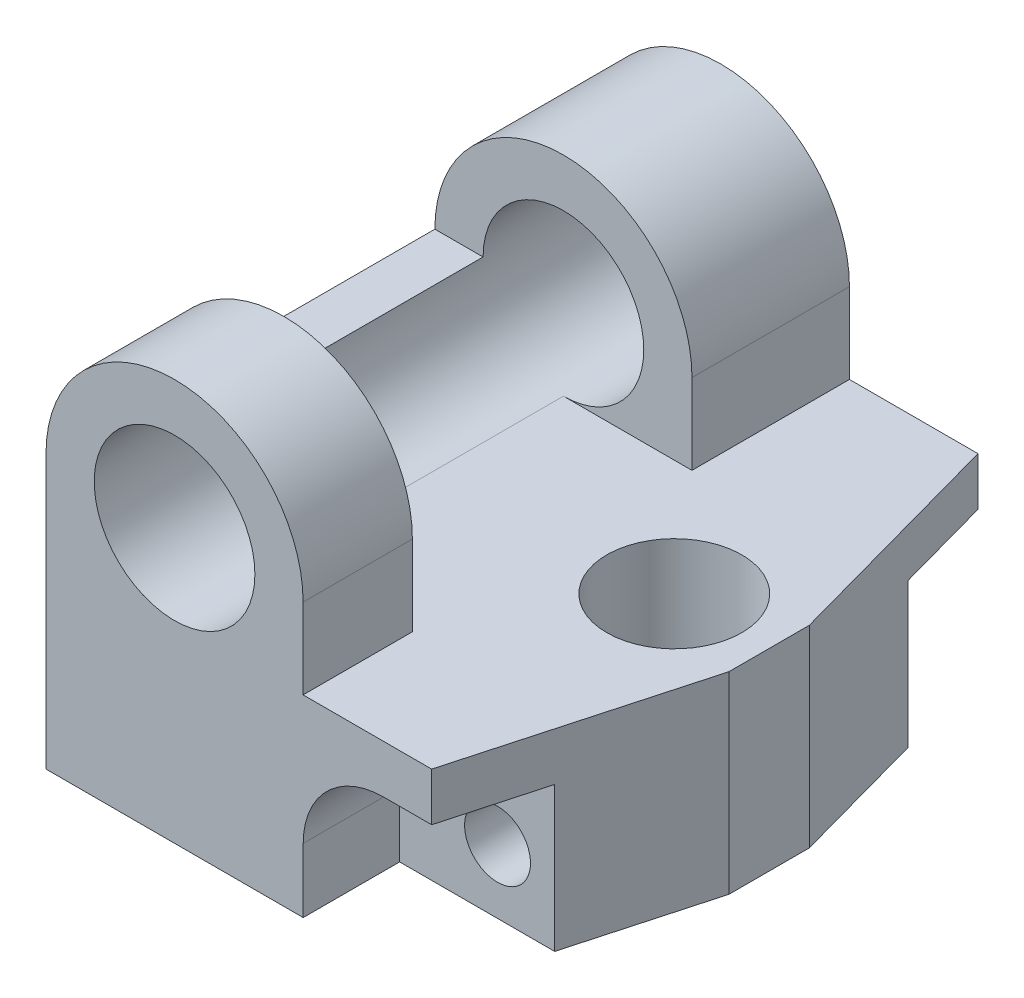
ISO-10303-21;
HEADER;
FILE_DESCRIPTION(('STEP AP214'),'2;1');
FILE_NAME('part.step','',(''),(''),'','','');
FILE_SCHEMA(('AUTOMOTIVE_DESIGN { 1 0 10303 214 1 1 1 1 }'));
ENDSEC;
DATA;
#1=APPLICATION_CONTEXT('core data for automotive mechanical design processes');
#2=APPLICATION_PROTOCOL_DEFINITION('international standard','automotive_design',2000,#1);
#3=PRODUCT_CONTEXT('',#1,'mechanical');
#4=PRODUCT('Part','Part','',(#3));
#5=PRODUCT_RELATED_PRODUCT_CATEGORY('part','',(#4));
#6=PRODUCT_DEFINITION_FORMATION('','',#4);
#7=PRODUCT_DEFINITION_CONTEXT('part definition',#1,'design');
#8=PRODUCT_DEFINITION('design','',#6,#7);
#9=PRODUCT_DEFINITION_SHAPE('','',#8);
#10=(LENGTH_UNIT() NAMED_UNIT(*) SI_UNIT(.MILLI.,.METRE.));
#11=(NAMED_UNIT(*) PLANE_ANGLE_UNIT() SI_UNIT($,.RADIAN.));
#12=(NAMED_UNIT(*) SI_UNIT($,.STERADIAN.) SOLID_ANGLE_UNIT());
#13=UNCERTAINTY_MEASURE_WITH_UNIT(LENGTH_MEASURE(1.E-05),#10,'distance_accuracy_value','');
#14=(GEOMETRIC_REPRESENTATION_CONTEXT(3) GLOBAL_UNCERTAINTY_ASSIGNED_CONTEXT((#13)) GLOBAL_UNIT_ASSIGNED_CONTEXT((#10,
#11,#12)) REPRESENTATION_CONTEXT('',''));
#15=CARTESIAN_POINT('',(0.,0.,0.));
#16=DIRECTION('',(0.,0.,1.));
#17=DIRECTION('',(1.,0.,0.));
#18=AXIS2_PLACEMENT_3D('',#15,#16,#17);
#19=CARTESIAN_POINT('',(8.,2.5,8.5));
#20=DIRECTION('',(-1.,0.,0.));
#21=DIRECTION('',(0.,0.,1.));
#22=AXIS2_PLACEMENT_3D('',#19,#20,#21);
#23=PLANE('',#22);
#24=DIRECTION('',(0.,1.,0.));
#25=VECTOR('',#24,1.);
#26=CARTESIAN_POINT('',(8.,0.,-3.6));
#27=LINE('',#26,#25);
#28=CARTESIAN_POINT('',(8.,0.,-3.6));
#29=VERTEX_POINT('',#28);
#30=CARTESIAN_POINT('',(8.,2.5,-3.6));
#31=VERTEX_POINT('',#30);
#32=EDGE_CURVE('E194',#29,#31,#27,.T.);
#33=ORIENTED_EDGE('',*,*,#32,.F.);
#34=DIRECTION('',(0.,0.,-1.));
#35=VECTOR('',#34,1.);
#36=CARTESIAN_POINT('',(8.,0.,8.5));
#37=LINE('',#36,#35);
#38=CARTESIAN_POINT('',(8.,0.,-8.5));
#39=VERTEX_POINT('',#38);
#40=EDGE_CURVE('E219',#29,#39,#37,.T.);
#41=ORIENTED_EDGE('',*,*,#40,.T.);
#42=DIRECTION('',(0.,1.,0.));
#43=VECTOR('',#42,1.);
#44=CARTESIAN_POINT('',(8.,2.5,-8.5));
#45=LINE('',#44,#43);
#46=CARTESIAN_POINT('',(8.,2.5,-8.5));
#47=VERTEX_POINT('',#46);
#48=EDGE_CURVE('E660',#39,#47,#45,.T.);
#49=ORIENTED_EDGE('',*,*,#48,.T.);
#50=DIRECTION('',(0.,0.,-1.));
#51=VECTOR('',#50,1.);
#52=CARTESIAN_POINT('',(8.,2.5,8.5));
#53=LINE('',#52,#51);
#54=EDGE_CURVE('E211',#31,#47,#53,.T.);
#55=ORIENTED_EDGE('',*,*,#54,.F.);
#56=EDGE_LOOP('',(#33,#41,#49,#55));
#57=FACE_BOUND('',#56,.T.);
#58=ADVANCED_FACE('F36',(#57),#23,.F.);
#59=CARTESIAN_POINT('',(4.,2.5,8.5));
#60=DIRECTION('',(0.,0.,-1.));
#61=DIRECTION('',(-1.,0.,0.));
#62=AXIS2_PLACEMENT_3D('',#59,#60,#61);
#63=CYLINDRICAL_SURFACE('',#62,4.);
#64=CARTESIAN_POINT('',(4.,2.5,-3.6));
#65=DIRECTION('',(0.,0.,1.));
#66=DIRECTION('',(1.,0.,0.));
#67=AXIS2_PLACEMENT_3D('',#64,#65,#66);
#68=CIRCLE('',#67,4.);
#69=CARTESIAN_POINT('',(0.,2.5,-3.6));
#70=VERTEX_POINT('',#69);
#71=EDGE_CURVE('E188',#31,#70,#68,.T.);
#72=ORIENTED_EDGE('',*,*,#71,.F.);
#73=ORIENTED_EDGE('',*,*,#54,.T.);
#74=CARTESIAN_POINT('',(4.,2.5,-8.5));
#75=DIRECTION('',(0.,0.,1.));
#76=DIRECTION('',(1.,0.,0.));
#77=AXIS2_PLACEMENT_3D('',#74,#75,#76);
#78=CIRCLE('',#77,4.);
#79=CARTESIAN_POINT('',(0.,2.5,-8.5));
#80=VERTEX_POINT('',#79);
#81=EDGE_CURVE('E202',#47,#80,#78,.T.);
#82=ORIENTED_EDGE('',*,*,#81,.T.);
#83=DIRECTION('',(0.,0.,-1.));
#84=VECTOR('',#83,1.);
#85=CARTESIAN_POINT('',(0.,2.5,8.5));
#86=LINE('',#85,#84);
#87=EDGE_CURVE('E199',#70,#80,#86,.T.);
#88=ORIENTED_EDGE('',*,*,#87,.F.);
#89=EDGE_LOOP('',(#72,#73,#82,#88));
#90=FACE_BOUND('',#89,.T.);
#91=ADVANCED_FACE('F200',(#90),#63,.T.);
#92=CARTESIAN_POINT('',(4.,2.5,8.5));
#93=DIRECTION('',(0.,0.,-1.));
#94=DIRECTION('',(-1.,0.,0.));
#95=AXIS2_PLACEMENT_3D('',#92,#93,#94);
#96=CYLINDRICAL_SURFACE('',#95,2.5);
#97=CARTESIAN_POINT('',(4.,2.5,-8.5));
#98=DIRECTION('',(0.,0.,1.));
#99=DIRECTION('',(1.,0.,0.));
#100=AXIS2_PLACEMENT_3D('',#97,#98,#99);
#101=CIRCLE('',#100,2.5);
#102=CARTESIAN_POINT('',(6.5,2.5,-8.5));
#103=VERTEX_POINT('',#102);
#104=EDGE_CURVE('E638',#103,#103,#101,.T.);
#105=ORIENTED_EDGE('',*,*,#104,.F.);
#106=EDGE_LOOP('',(#105));
#107=FACE_BOUND('',#106,.T.);
#108=CARTESIAN_POINT('',(4.,2.5,8.5));
#109=DIRECTION('',(0.,0.,1.));
#110=DIRECTION('',(1.,0.,0.));
#111=AXIS2_PLACEMENT_3D('',#108,#109,#110);
#112=CIRCLE('',#111,2.5);
#113=CARTESIAN_POINT('',(6.5,2.5,8.5));
#114=VERTEX_POINT('',#113);
#115=EDGE_CURVE('E639',#114,#114,#112,.T.);
#116=ORIENTED_EDGE('',*,*,#115,.T.);
#117=EDGE_LOOP('',(#116));
#118=FACE_BOUND('',#117,.T.);
#119=DIRECTION('',(0.,0.,-1.));
#120=VECTOR('',#119,1.);
#121=CARTESIAN_POINT('',(4.,0.,5.1));
#122=LINE('',#121,#120);
#123=CARTESIAN_POINT('',(4.,0.,5.1));
#124=VERTEX_POINT('',#123);
#125=CARTESIAN_POINT('',(4.,0.,-3.6));
#126=VERTEX_POINT('',#125);
#127=EDGE_CURVE('E322',#124,#126,#122,.T.);
#128=ORIENTED_EDGE('',*,*,#127,.T.);
#129=CARTESIAN_POINT('',(4.,2.5,-3.6));
#130=DIRECTION('',(0.,0.,-1.));
#131=DIRECTION('',(1.,0.,0.));
#132=AXIS2_PLACEMENT_3D('',#129,#130,#131);
#133=CIRCLE('',#132,2.5);
#134=CARTESIAN_POINT('',(1.5,2.5,-3.6));
#135=VERTEX_POINT('',#134);
#136=EDGE_CURVE('E187',#135,#126,#133,.T.);
#137=ORIENTED_EDGE('',*,*,#136,.F.);
#138=DIRECTION('',(0.,0.,-1.));
#139=VECTOR('',#138,1.);
#140=CARTESIAN_POINT('',(1.5,2.5,5.1));
#141=LINE('',#140,#139);
#142=CARTESIAN_POINT('',(1.5,2.5,5.1));
#143=VERTEX_POINT('',#142);
#144=EDGE_CURVE('E183',#143,#135,#141,.T.);
#145=ORIENTED_EDGE('',*,*,#144,.F.);
#146=CARTESIAN_POINT('',(4.,2.5,5.1));
#147=DIRECTION('',(0.,0.,-1.));
#148=DIRECTION('',(1.,0.,0.));
#149=AXIS2_PLACEMENT_3D('',#146,#147,#148);
#150=CIRCLE('',#149,2.5);
#151=EDGE_CURVE('E326',#143,#124,#150,.T.);
#152=ORIENTED_EDGE('',*,*,#151,.T.);
#153=EDGE_LOOP('',(#128,#137,#145,#152));
#154=FACE_BOUND('',#153,.T.);
#155=ADVANCED_FACE('F291',(#107,#118,#154),#96,.F.);
#156=CARTESIAN_POINT('',(4.,2.5,-8.5));
#157=DIRECTION('',(0.,0.,1.));
#158=DIRECTION('',(1.,0.,0.));
#159=AXIS2_PLACEMENT_3D('',#156,#157,#158);
#160=PLANE('',#159);
#161=ORIENTED_EDGE('',*,*,#104,.T.);
#162=EDGE_LOOP('',(#161));
#163=FACE_BOUND('',#162,.T.);
#164=DIRECTION('',(-1.,0.,0.));
#165=VECTOR('',#164,1.);
#166=CARTESIAN_POINT('',(12.,-1.5,-8.5));
#167=LINE('',#166,#165);
#168=CARTESIAN_POINT('',(12.,-1.5,-8.5));
#169=VERTEX_POINT('',#168);
#170=CARTESIAN_POINT('',(10.5034128963792,-1.5,-8.5));
#171=VERTEX_POINT('',#170);
#172=EDGE_CURVE('E272',#169,#171,#167,.T.);
#173=ORIENTED_EDGE('',*,*,#172,.T.);
#174=CARTESIAN_POINT('',(10.5034128963792,-4.,-8.5));
#175=DIRECTION('',(0.,0.,1.));
#176=DIRECTION('',(1.,0.,0.));
#177=AXIS2_PLACEMENT_3D('',#174,#175,#176);
#178=CIRCLE('',#177,2.5);
#179=CARTESIAN_POINT('',(8.00341289637922,-4.,-8.5));
#180=VERTEX_POINT('',#179);
#181=EDGE_CURVE('E11',#171,#180,#178,.T.);
#182=ORIENTED_EDGE('',*,*,#181,.T.);
#183=DIRECTION('',(0.,-1.,0.));
#184=VECTOR('',#183,1.);
#185=CARTESIAN_POINT('',(8.00341289637922,-1.5,-8.5));
#186=LINE('',#185,#184);
#187=CARTESIAN_POINT('',(8.00341289637922,-6.,-8.5));
#188=VERTEX_POINT('',#187);
#189=EDGE_CURVE('E596',#180,#188,#186,.T.);
#190=ORIENTED_EDGE('',*,*,#189,.T.);
#191=DIRECTION('',(1.,0.,0.));
#192=VECTOR('',#191,1.);
#193=CARTESIAN_POINT('',(0.,-6.,-8.5));
#194=LINE('',#193,#192);
#195=CARTESIAN_POINT('',(0.,-6.,-8.5));
#196=VERTEX_POINT('',#195);
#197=EDGE_CURVE('E642',#196,#188,#194,.T.);
#198=ORIENTED_EDGE('',*,*,#197,.F.);
#199=DIRECTION('',(0.,-1.,0.));
#200=VECTOR('',#199,1.);
#201=CARTESIAN_POINT('',(0.,0.,-8.5));
#202=LINE('',#201,#200);
#203=EDGE_CURVE('E214',#80,#196,#202,.T.);
#204=ORIENTED_EDGE('',*,*,#203,.F.);
#205=ORIENTED_EDGE('',*,*,#81,.F.);
#206=ORIENTED_EDGE('',*,*,#48,.F.);
#207=DIRECTION('',(-1.,0.,0.));
#208=VECTOR('',#207,1.);
#209=CARTESIAN_POINT('',(8.,0.,-8.5));
#210=LINE('',#209,#208);
#211=CARTESIAN_POINT('',(12.,0.,-8.5));
#212=VERTEX_POINT('',#211);
#213=EDGE_CURVE('E657',#212,#39,#210,.T.);
#214=ORIENTED_EDGE('',*,*,#213,.F.);
#215=DIRECTION('',(0.,1.,0.));
#216=VECTOR('',#215,1.);
#217=CARTESIAN_POINT('',(12.,-17.,-8.5));
#218=LINE('',#217,#216);
#219=EDGE_CURVE('E631',#169,#212,#218,.T.);
#220=ORIENTED_EDGE('',*,*,#219,.F.);
#221=EDGE_LOOP('',(#173,#182,#190,#198,#204,#205,#206,#214,#220));
#222=FACE_BOUND('',#221,.T.);
#223=ADVANCED_FACE('F430',(#163,#222),#160,.F.);
#224=CARTESIAN_POINT('',(0.,-6.,8.5));
#225=DIRECTION('',(0.,1.,0.));
#226=DIRECTION('',(0.,0.,1.));
#227=AXIS2_PLACEMENT_3D('',#224,#225,#226);
#228=PLANE('',#227);
#229=CARTESIAN_POINT('',(11.05,-6.,0.));
#230=DIRECTION('',(0.,1.,0.));
#231=DIRECTION('',(0.,0.,1.));
#232=AXIS2_PLACEMENT_3D('',#229,#230,#231);
#233=CIRCLE('',#232,2.1);
#234=CARTESIAN_POINT('',(11.05,-6.,2.1));
#235=VERTEX_POINT('',#234);
#236=EDGE_CURVE('E594',#235,#235,#233,.F.);
#237=ORIENTED_EDGE('',*,*,#236,.F.);
#238=EDGE_LOOP('',(#237));
#239=FACE_BOUND('',#238,.T.);
#240=DIRECTION('',(0.,0.,-1.));
#241=VECTOR('',#240,1.);
#242=CARTESIAN_POINT('',(8.00341289637922,-6.,8.5));
#243=LINE('',#242,#241);
#244=CARTESIAN_POINT('',(8.00341289637922,-6.,-5.50000000000001));
#245=VERTEX_POINT('',#244);
#246=EDGE_CURVE('E253',#245,#188,#243,.T.);
#247=ORIENTED_EDGE('',*,*,#246,.F.);
#248=DIRECTION('',(1.,0.,0.));
#249=VECTOR('',#248,1.);
#250=CARTESIAN_POINT('',(0.,-6.,-5.50000000000001));
#251=LINE('',#250,#249);
#252=CARTESIAN_POINT('',(12.8275862068965,-6.,-5.50000000000001));
#253=VERTEX_POINT('',#252);
#254=EDGE_CURVE('E599',#245,#253,#251,.T.);
#255=ORIENTED_EDGE('',*,*,#254,.T.);
#256=DIRECTION('',(-0.265928998125814,0.,-0.963992618206074));
#257=VECTOR('',#256,1.);
#258=CARTESIAN_POINT('',(15.5093922651934,-6.,4.22154696132596));
#259=LINE('',#258,#257);
#260=CARTESIAN_POINT('',(14.,-6.,-1.25000000000001));
#261=VERTEX_POINT('',#260);
#262=EDGE_CURVE('E633',#261,#253,#259,.T.);
#263=ORIENTED_EDGE('',*,*,#262,.F.);
#264=DIRECTION('',(0.,0.,-1.));
#265=VECTOR('',#264,1.);
#266=CARTESIAN_POINT('',(14.,-6.,8.5));
#267=LINE('',#266,#265);
#268=CARTESIAN_POINT('',(14.,-6.,1.25000000000001));
#269=VERTEX_POINT('',#268);
#270=EDGE_CURVE('E225',#269,#261,#267,.T.);
#271=ORIENTED_EDGE('',*,*,#270,.F.);
#272=DIRECTION('',(-0.265928998125814,0.,0.963992618206074));
#273=VECTOR('',#272,1.);
#274=CARTESIAN_POINT('',(11.1513812154696,-6.,11.5762430939227));
#275=LINE('',#274,#273);
#276=CARTESIAN_POINT('',(12.8275862068966,-6.,5.50000000000001));
#277=VERTEX_POINT('',#276);
#278=EDGE_CURVE('E624',#269,#277,#275,.T.);
#279=ORIENTED_EDGE('',*,*,#278,.T.);
#280=DIRECTION('',(-1.,0.,0.));
#281=VECTOR('',#280,1.);
#282=CARTESIAN_POINT('',(0.,-6.,5.50000000000001));
#283=LINE('',#282,#281);
#284=CARTESIAN_POINT('',(8.00341289637922,-6.,5.50000000000001));
#285=VERTEX_POINT('',#284);
#286=EDGE_CURVE('E611',#277,#285,#283,.T.);
#287=ORIENTED_EDGE('',*,*,#286,.T.);
#288=DIRECTION('',(0.,0.,1.));
#289=VECTOR('',#288,1.);
#290=CARTESIAN_POINT('',(8.00341289637922,-6.,8.5));
#291=LINE('',#290,#289);
#292=CARTESIAN_POINT('',(8.00341289637922,-6.,8.5));
#293=VERTEX_POINT('',#292);
#294=EDGE_CURVE('E617',#285,#293,#291,.T.);
#295=ORIENTED_EDGE('',*,*,#294,.T.);
#296=DIRECTION('',(1.,0.,0.));
#297=VECTOR('',#296,1.);
#298=CARTESIAN_POINT('',(0.,-6.,8.5));
#299=LINE('',#298,#297);
#300=CARTESIAN_POINT('',(0.,-6.,8.5));
#301=VERTEX_POINT('',#300);
#302=EDGE_CURVE('E648',#301,#293,#299,.T.);
#303=ORIENTED_EDGE('',*,*,#302,.F.);
#304=DIRECTION('',(0.,0.,-1.));
#305=VECTOR('',#304,1.);
#306=CARTESIAN_POINT('',(0.,-6.,8.5));
#307=LINE('',#306,#305);
#308=EDGE_CURVE('E227',#301,#196,#307,.T.);
#309=ORIENTED_EDGE('',*,*,#308,.T.);
#310=ORIENTED_EDGE('',*,*,#197,.T.);
#311=EDGE_LOOP('',(#247,#255,#263,#271,#279,#287,#295,#303,#309,#310));
#312=FACE_BOUND('',#311,.T.);
#313=ADVANCED_FACE('F425',(#239,#312),#228,.F.);
#314=CARTESIAN_POINT('',(13.3303867403315,-17.,-3.67734806629835));
#315=DIRECTION('',(0.963992618206074,0.,-0.265928998125814));
#316=DIRECTION('',(-0.265928998125814,0.,-0.963992618206074));
#317=AXIS2_PLACEMENT_3D('',#314,#315,#316);
#318=PLANE('',#317);
#319=DIRECTION('',(0.,-1.,0.));
#320=VECTOR('',#319,1.);
#321=CARTESIAN_POINT('',(12.8275862068965,-17.,-5.50000000000001));
#322=LINE('',#321,#320);
#323=CARTESIAN_POINT('',(12.8275862068965,-1.5,-5.50000000000001));
#324=VERTEX_POINT('',#323);
#325=EDGE_CURVE('E248',#324,#253,#322,.T.);
#326=ORIENTED_EDGE('',*,*,#325,.F.);
#327=DIRECTION('',(-0.265928998125814,0.,-0.963992618206074));
#328=VECTOR('',#327,1.);
#329=CARTESIAN_POINT('',(13.3303867403315,-1.5,-3.67734806629835));
#330=LINE('',#329,#328);
#331=EDGE_CURVE('E250',#324,#169,#330,.T.);
#332=ORIENTED_EDGE('',*,*,#331,.T.);
#333=ORIENTED_EDGE('',*,*,#219,.T.);
#334=DIRECTION('',(-0.265928998125814,0.,-0.963992618206074));
#335=VECTOR('',#334,1.);
#336=CARTESIAN_POINT('',(13.3303867403315,0.,-3.67734806629835));
#337=LINE('',#336,#335);
#338=CARTESIAN_POINT('',(14.,0.,-1.25000000000001));
#339=VERTEX_POINT('',#338);
#340=EDGE_CURVE('E627',#339,#212,#337,.T.);
#341=ORIENTED_EDGE('',*,*,#340,.F.);
#342=DIRECTION('',(0.,1.,0.));
#343=VECTOR('',#342,1.);
#344=CARTESIAN_POINT('',(14.,-17.,-1.25000000000001));
#345=LINE('',#344,#343);
#346=EDGE_CURVE('E630',#261,#339,#345,.T.);
#347=ORIENTED_EDGE('',*,*,#346,.F.);
#348=ORIENTED_EDGE('',*,*,#262,.T.);
#349=EDGE_LOOP('',(#326,#332,#333,#341,#347,#348));
#350=FACE_BOUND('',#349,.T.);
#351=ADVANCED_FACE('F429',(#350),#318,.T.);
#352=CARTESIAN_POINT('',(14.,0.,8.5));
#353=DIRECTION('',(-1.,0.,0.));
#354=DIRECTION('',(0.,0.,1.));
#355=AXIS2_PLACEMENT_3D('',#352,#353,#354);
#356=PLANE('',#355);
#357=DIRECTION('',(0.,0.,-1.));
#358=VECTOR('',#357,1.);
#359=CARTESIAN_POINT('',(14.,0.,8.5));
#360=LINE('',#359,#358);
#361=CARTESIAN_POINT('',(14.,0.,1.25000000000001));
#362=VERTEX_POINT('',#361);
#363=EDGE_CURVE('E223',#362,#339,#360,.T.);
#364=ORIENTED_EDGE('',*,*,#363,.F.);
#365=DIRECTION('',(0.,1.,0.));
#366=VECTOR('',#365,1.);
#367=CARTESIAN_POINT('',(14.,-17.,1.25000000000001));
#368=LINE('',#367,#366);
#369=EDGE_CURVE('E622',#269,#362,#368,.T.);
#370=ORIENTED_EDGE('',*,*,#369,.F.);
#371=ORIENTED_EDGE('',*,*,#270,.T.);
#372=ORIENTED_EDGE('',*,*,#346,.T.);
#373=EDGE_LOOP('',(#364,#370,#371,#372));
#374=FACE_BOUND('',#373,.T.);
#375=ADVANCED_FACE('F459',(#374),#356,.F.);
#376=CARTESIAN_POINT('',(8.,0.,8.5));
#377=DIRECTION('',(0.,-1.,0.));
#378=DIRECTION('',(0.,0.,-1.));
#379=AXIS2_PLACEMENT_3D('',#376,#377,#378);
#380=PLANE('',#379);
#381=ORIENTED_EDGE('',*,*,#40,.F.);
#382=DIRECTION('',(1.,0.,0.));
#383=VECTOR('',#382,1.);
#384=CARTESIAN_POINT('',(4.,0.,-3.6));
#385=LINE('',#384,#383);
#386=EDGE_CURVE('E673',#126,#29,#385,.T.);
#387=ORIENTED_EDGE('',*,*,#386,.F.);
#388=ORIENTED_EDGE('',*,*,#127,.F.);
#389=DIRECTION('',(1.,0.,0.));
#390=VECTOR('',#389,1.);
#391=CARTESIAN_POINT('',(4.,0.,5.1));
#392=LINE('',#391,#390);
#393=CARTESIAN_POINT('',(8.,0.,5.1));
#394=VERTEX_POINT('',#393);
#395=EDGE_CURVE('E320',#124,#394,#392,.T.);
#396=ORIENTED_EDGE('',*,*,#395,.T.);
#397=CARTESIAN_POINT('',(8.,0.,8.5));
#398=VERTEX_POINT('',#397);
#399=EDGE_CURVE('E220',#398,#394,#37,.T.);
#400=ORIENTED_EDGE('',*,*,#399,.F.);
#401=DIRECTION('',(-1.,0.,0.));
#402=VECTOR('',#401,1.);
#403=CARTESIAN_POINT('',(8.,0.,8.5));
#404=LINE('',#403,#402);
#405=CARTESIAN_POINT('',(12.,0.,8.5));
#406=VERTEX_POINT('',#405);
#407=EDGE_CURVE('E318',#406,#398,#404,.T.);
#408=ORIENTED_EDGE('',*,*,#407,.F.);
#409=DIRECTION('',(-0.265928998125814,0.,0.963992618206074));
#410=VECTOR('',#409,1.);
#411=CARTESIAN_POINT('',(13.3303867403315,0.,3.67734806629835));
#412=LINE('',#411,#410);
#413=EDGE_CURVE('E620',#362,#406,#412,.T.);
#414=ORIENTED_EDGE('',*,*,#413,.F.);
#415=ORIENTED_EDGE('',*,*,#363,.T.);
#416=ORIENTED_EDGE('',*,*,#340,.T.);
#417=ORIENTED_EDGE('',*,*,#213,.T.);
#418=EDGE_LOOP('',(#381,#387,#388,#396,#400,#408,#414,#415,#416,#417));
#419=FACE_BOUND('',#418,.T.);
#420=CARTESIAN_POINT('',(11.05,0.,0.));
#421=DIRECTION('',(0.,1.,0.));
#422=DIRECTION('',(0.,0.,1.));
#423=AXIS2_PLACEMENT_3D('',#420,#421,#422);
#424=CIRCLE('',#423,2.1);
#425=CARTESIAN_POINT('',(11.05,0.,2.1));
#426=VERTEX_POINT('',#425);
#427=EDGE_CURVE('E591',#426,#426,#424,.T.);
#428=ORIENTED_EDGE('',*,*,#427,.F.);
#429=EDGE_LOOP('',(#428));
#430=FACE_BOUND('',#429,.T.);
#431=ADVANCED_FACE('F303',(#419,#430),#380,.F.);
#432=CARTESIAN_POINT('',(4.,2.5,8.5));
#433=DIRECTION('',(0.,0.,1.));
#434=DIRECTION('',(1.,0.,0.));
#435=AXIS2_PLACEMENT_3D('',#432,#433,#434);
#436=PLANE('',#435);
#437=DIRECTION('',(0.,-1.,0.));
#438=VECTOR('',#437,1.);
#439=CARTESIAN_POINT('',(8.00341289637922,-6.78216811269895,8.5));
#440=LINE('',#439,#438);
#441=CARTESIAN_POINT('',(8.00341289637922,-4.,8.5));
#442=VERTEX_POINT('',#441);
#443=EDGE_CURVE('E609',#442,#293,#440,.T.);
#444=ORIENTED_EDGE('',*,*,#443,.F.);
#445=CARTESIAN_POINT('',(10.5034128963792,-4.,8.5));
#446=DIRECTION('',(0.,0.,1.));
#447=DIRECTION('',(1.,0.,0.));
#448=AXIS2_PLACEMENT_3D('',#445,#446,#447);
#449=CIRCLE('',#448,2.5);
#450=CARTESIAN_POINT('',(10.5034128963792,-1.5,8.5));
#451=VERTEX_POINT('',#450);
#452=EDGE_CURVE('E246',#442,#451,#449,.F.);
#453=ORIENTED_EDGE('',*,*,#452,.T.);
#454=DIRECTION('',(-1.,0.,0.));
#455=VECTOR('',#454,1.);
#456=CARTESIAN_POINT('',(12.,-1.5,8.5));
#457=LINE('',#456,#455);
#458=CARTESIAN_POINT('',(12.,-1.5,8.5));
#459=VERTEX_POINT('',#458);
#460=EDGE_CURVE('E604',#459,#451,#457,.T.);
#461=ORIENTED_EDGE('',*,*,#460,.F.);
#462=DIRECTION('',(0.,-1.,0.));
#463=VECTOR('',#462,1.);
#464=CARTESIAN_POINT('',(12.,2.5,8.5));
#465=LINE('',#464,#463);
#466=EDGE_CURVE('E230',#406,#459,#465,.T.);
#467=ORIENTED_EDGE('',*,*,#466,.F.);
#468=ORIENTED_EDGE('',*,*,#407,.T.);
#469=DIRECTION('',(0.,1.,0.));
#470=VECTOR('',#469,1.);
#471=CARTESIAN_POINT('',(8.,2.5,8.5));
#472=LINE('',#471,#470);
#473=CARTESIAN_POINT('',(8.,2.5,8.5));
#474=VERTEX_POINT('',#473);
#475=EDGE_CURVE('E312',#398,#474,#472,.T.);
#476=ORIENTED_EDGE('',*,*,#475,.T.);
#477=CARTESIAN_POINT('',(4.,2.5,8.5));
#478=DIRECTION('',(0.,0.,1.));
#479=DIRECTION('',(1.,0.,0.));
#480=AXIS2_PLACEMENT_3D('',#477,#478,#479);
#481=CIRCLE('',#480,4.);
#482=CARTESIAN_POINT('',(0.,2.5,8.5));
#483=VERTEX_POINT('',#482);
#484=EDGE_CURVE('E205',#474,#483,#481,.T.);
#485=ORIENTED_EDGE('',*,*,#484,.T.);
#486=DIRECTION('',(0.,-1.,0.));
#487=VECTOR('',#486,1.);
#488=CARTESIAN_POINT('',(0.,0.,8.5));
#489=LINE('',#488,#487);
#490=EDGE_CURVE('E645',#483,#301,#489,.T.);
#491=ORIENTED_EDGE('',*,*,#490,.T.);
#492=ORIENTED_EDGE('',*,*,#302,.T.);
#493=EDGE_LOOP('',(#444,#453,#461,#467,#468,#476,#485,#491,#492));
#494=FACE_BOUND('',#493,.T.);
#495=ORIENTED_EDGE('',*,*,#115,.F.);
#496=EDGE_LOOP('',(#495));
#497=FACE_BOUND('',#496,.T.);
#498=ADVANCED_FACE('F296',(#494,#497),#436,.T.);
#499=ORIENTED_EDGE('',*,*,#399,.T.);
#500=DIRECTION('',(0.,1.,0.));
#501=VECTOR('',#500,1.);
#502=CARTESIAN_POINT('',(8.,0.,5.1));
#503=LINE('',#502,#501);
#504=CARTESIAN_POINT('',(8.,2.5,5.1));
#505=VERTEX_POINT('',#504);
#506=EDGE_CURVE('E311',#394,#505,#503,.T.);
#507=ORIENTED_EDGE('',*,*,#506,.T.);
#508=EDGE_CURVE('E216',#474,#505,#53,.T.);
#509=ORIENTED_EDGE('',*,*,#508,.F.);
#510=ORIENTED_EDGE('',*,*,#475,.F.);
#511=EDGE_LOOP('',(#499,#507,#509,#510));
#512=FACE_BOUND('',#511,.T.);
#513=ADVANCED_FACE('F287',(#512),#23,.F.);
#514=ORIENTED_EDGE('',*,*,#508,.T.);
#515=CARTESIAN_POINT('',(4.,2.5,5.1));
#516=DIRECTION('',(0.,0.,1.));
#517=DIRECTION('',(1.,0.,0.));
#518=AXIS2_PLACEMENT_3D('',#515,#516,#517);
#519=CIRCLE('',#518,4.);
#520=CARTESIAN_POINT('',(0.,2.5,5.1));
#521=VERTEX_POINT('',#520);
#522=EDGE_CURVE('E330',#505,#521,#519,.T.);
#523=ORIENTED_EDGE('',*,*,#522,.T.);
#524=EDGE_CURVE('E207',#483,#521,#86,.T.);
#525=ORIENTED_EDGE('',*,*,#524,.F.);
#526=ORIENTED_EDGE('',*,*,#484,.F.);
#527=EDGE_LOOP('',(#514,#523,#525,#526));
#528=FACE_BOUND('',#527,.T.);
#529=ADVANCED_FACE('F293',(#528),#63,.T.);
#530=CARTESIAN_POINT('',(0.,0.,8.5));
#531=DIRECTION('',(1.,0.,0.));
#532=DIRECTION('',(0.,1.,0.));
#533=AXIS2_PLACEMENT_3D('',#530,#531,#532);
#534=PLANE('',#533);
#535=ORIENTED_EDGE('',*,*,#203,.T.);
#536=ORIENTED_EDGE('',*,*,#308,.F.);
#537=ORIENTED_EDGE('',*,*,#490,.F.);
#538=ORIENTED_EDGE('',*,*,#524,.T.);
#539=EDGE_CURVE('E180',#521,#70,#86,.T.);
#540=ORIENTED_EDGE('',*,*,#539,.T.);
#541=ORIENTED_EDGE('',*,*,#87,.T.);
#542=EDGE_LOOP('',(#535,#536,#537,#538,#540,#541));
#543=FACE_BOUND('',#542,.T.);
#544=ADVANCED_FACE('F209',(#543),#534,.F.);
#545=CARTESIAN_POINT('',(13.3303867403315,-17.,3.67734806629835));
#546=DIRECTION('',(-0.963992618206074,0.,-0.265928998125814));
#547=DIRECTION('',(-0.265928998125814,0.,0.963992618206074));
#548=AXIS2_PLACEMENT_3D('',#545,#546,#547);
#549=PLANE('',#548);
#550=ORIENTED_EDGE('',*,*,#466,.T.);
#551=DIRECTION('',(0.265928998125814,0.,-0.963992618206074));
#552=VECTOR('',#551,1.);
#553=CARTESIAN_POINT('',(13.3303867403315,-1.5,3.67734806629835));
#554=LINE('',#553,#552);
#555=CARTESIAN_POINT('',(12.8275862068965,-1.5,5.50000000000001));
#556=VERTEX_POINT('',#555);
#557=EDGE_CURVE('E236',#459,#556,#554,.T.);
#558=ORIENTED_EDGE('',*,*,#557,.T.);
#559=DIRECTION('',(0.,-1.,0.));
#560=VECTOR('',#559,1.);
#561=CARTESIAN_POINT('',(12.8275862068965,-17.,5.50000000000001));
#562=LINE('',#561,#560);
#563=EDGE_CURVE('E233',#556,#277,#562,.T.);
#564=ORIENTED_EDGE('',*,*,#563,.T.);
#565=ORIENTED_EDGE('',*,*,#278,.F.);
#566=ORIENTED_EDGE('',*,*,#369,.T.);
#567=ORIENTED_EDGE('',*,*,#413,.T.);
#568=EDGE_LOOP('',(#550,#558,#564,#565,#566,#567));
#569=FACE_BOUND('',#568,.T.);
#570=ADVANCED_FACE('F493',(#569),#549,.F.);
#571=CARTESIAN_POINT('',(8.00341289637922,-6.78216811269895,5.50000000000001));
#572=DIRECTION('',(-1.,0.,0.));
#573=DIRECTION('',(0.,0.,1.));
#574=AXIS2_PLACEMENT_3D('',#571,#572,#573);
#575=PLANE('',#574);
#576=DIRECTION('',(0.,-1.,0.));
#577=VECTOR('',#576,1.);
#578=CARTESIAN_POINT('',(8.00341289637922,-1.5,5.50000000000001));
#579=LINE('',#578,#577);
#580=CARTESIAN_POINT('',(8.00341289637922,-4.,5.50000000000001));
#581=VERTEX_POINT('',#580);
#582=EDGE_CURVE('E608',#581,#285,#579,.T.);
#583=ORIENTED_EDGE('',*,*,#582,.F.);
#584=DIRECTION('',(0.,0.,1.));
#585=VECTOR('',#584,1.);
#586=CARTESIAN_POINT('',(8.00341289637922,-4.,8.5));
#587=LINE('',#586,#585);
#588=EDGE_CURVE('E239',#581,#442,#587,.T.);
#589=ORIENTED_EDGE('',*,*,#588,.T.);
#590=ORIENTED_EDGE('',*,*,#443,.T.);
#591=ORIENTED_EDGE('',*,*,#294,.F.);
#592=EDGE_LOOP('',(#583,#589,#590,#591));
#593=FACE_BOUND('',#592,.T.);
#594=ADVANCED_FACE('F482',(#593),#575,.F.);
#595=CARTESIAN_POINT('',(12.,-1.5,5.50000000000001));
#596=DIRECTION('',(0.,1.,0.));
#597=DIRECTION('',(-1.,0.,0.));
#598=AXIS2_PLACEMENT_3D('',#595,#596,#597);
#599=PLANE('',#598);
#600=ORIENTED_EDGE('',*,*,#460,.T.);
#601=DIRECTION('',(0.,0.,1.));
#602=VECTOR('',#601,1.);
#603=CARTESIAN_POINT('',(10.5034128963792,-1.5,5.50000000000001));
#604=LINE('',#603,#602);
#605=CARTESIAN_POINT('',(10.5034128963792,-1.5,5.50000000000001));
#606=VERTEX_POINT('',#605);
#607=EDGE_CURVE('E242',#451,#606,#604,.F.);
#608=ORIENTED_EDGE('',*,*,#607,.T.);
#609=DIRECTION('',(-1.,0.,0.));
#610=VECTOR('',#609,1.);
#611=CARTESIAN_POINT('',(12.,-1.5,5.50000000000001));
#612=LINE('',#611,#610);
#613=EDGE_CURVE('E605',#556,#606,#612,.T.);
#614=ORIENTED_EDGE('',*,*,#613,.F.);
#615=ORIENTED_EDGE('',*,*,#557,.F.);
#616=EDGE_LOOP('',(#600,#608,#614,#615));
#617=FACE_BOUND('',#616,.T.);
#618=ADVANCED_FACE('F415',(#617),#599,.F.);
#619=CARTESIAN_POINT('',(0.,0.,5.50000000000001));
#620=DIRECTION('',(0.,0.,-1.));
#621=DIRECTION('',(-1.,0.,0.));
#622=AXIS2_PLACEMENT_3D('',#619,#620,#621);
#623=PLANE('',#622);
#624=CARTESIAN_POINT('',(11.05,-4.,5.50000000000001));
#625=DIRECTION('',(0.,0.,1.));
#626=DIRECTION('',(1.,0.,0.));
#627=AXIS2_PLACEMENT_3D('',#624,#625,#626);
#628=CIRCLE('',#627,1.025);
#629=CARTESIAN_POINT('',(12.075,-4.,5.50000000000001));
#630=VERTEX_POINT('',#629);
#631=EDGE_CURVE('E346',#630,#630,#628,.T.);
#632=ORIENTED_EDGE('',*,*,#631,.F.);
#633=EDGE_LOOP('',(#632));
#634=FACE_BOUND('',#633,.T.);
#635=ORIENTED_EDGE('',*,*,#613,.T.);
#636=CARTESIAN_POINT('',(10.5034128963792,-4.,5.50000000000001));
#637=DIRECTION('',(0.,0.,-1.));
#638=DIRECTION('',(-1.,0.,0.));
#639=AXIS2_PLACEMENT_3D('',#636,#637,#638);
#640=CIRCLE('',#639,2.5);
#641=EDGE_CURVE('E244',#606,#581,#640,.F.);
#642=ORIENTED_EDGE('',*,*,#641,.T.);
#643=ORIENTED_EDGE('',*,*,#582,.T.);
#644=ORIENTED_EDGE('',*,*,#286,.F.);
#645=ORIENTED_EDGE('',*,*,#563,.F.);
#646=EDGE_LOOP('',(#635,#642,#643,#644,#645));
#647=FACE_BOUND('',#646,.T.);
#648=ADVANCED_FACE('F409',(#634,#647),#623,.F.);
#649=CARTESIAN_POINT('',(10.5034128963792,-4.,5.50000000000001));
#650=DIRECTION('',(0.,0.,-1.));
#651=DIRECTION('',(-1.,0.,0.));
#652=AXIS2_PLACEMENT_3D('',#649,#650,#651);
#653=CYLINDRICAL_SURFACE('',#652,2.5);
#654=ORIENTED_EDGE('',*,*,#641,.F.);
#655=ORIENTED_EDGE('',*,*,#607,.F.);
#656=ORIENTED_EDGE('',*,*,#452,.F.);
#657=ORIENTED_EDGE('',*,*,#588,.F.);
#658=EDGE_LOOP('',(#654,#655,#656,#657));
#659=FACE_BOUND('',#658,.T.);
#660=ADVANCED_FACE('F414',(#659),#653,.F.);
#661=CARTESIAN_POINT('',(8.00341289637922,-1.5,-5.50000000000001));
#662=DIRECTION('',(1.,0.,0.));
#663=DIRECTION('',(0.,0.,-1.));
#664=AXIS2_PLACEMENT_3D('',#661,#662,#663);
#665=PLANE('',#664);
#666=ORIENTED_EDGE('',*,*,#189,.F.);
#667=DIRECTION('',(0.,0.,-1.));
#668=VECTOR('',#667,1.);
#669=CARTESIAN_POINT('',(8.00341289637922,-4.,-5.50000000000001));
#670=LINE('',#669,#668);
#671=CARTESIAN_POINT('',(8.00341289637922,-4.,-5.50000000000001));
#672=VERTEX_POINT('',#671);
#673=EDGE_CURVE('E51',#180,#672,#670,.F.);
#674=ORIENTED_EDGE('',*,*,#673,.T.);
#675=DIRECTION('',(0.,-1.,0.));
#676=VECTOR('',#675,1.);
#677=CARTESIAN_POINT('',(8.00341289637922,-6.78216811269895,-5.50000000000001));
#678=LINE('',#677,#676);
#679=EDGE_CURVE('E266',#672,#245,#678,.T.);
#680=ORIENTED_EDGE('',*,*,#679,.T.);
#681=ORIENTED_EDGE('',*,*,#246,.T.);
#682=EDGE_LOOP('',(#666,#674,#680,#681));
#683=FACE_BOUND('',#682,.T.);
#684=ADVANCED_FACE('F396',(#683),#665,.T.);
#685=CARTESIAN_POINT('',(0.,0.,-5.50000000000001));
#686=DIRECTION('',(0.,0.,1.));
#687=DIRECTION('',(-1.,0.,0.));
#688=AXIS2_PLACEMENT_3D('',#685,#686,#687);
#689=PLANE('',#688);
#690=CARTESIAN_POINT('',(11.05,-4.,-5.50000000000001));
#691=DIRECTION('',(0.,0.,-1.));
#692=DIRECTION('',(-1.,0.,0.));
#693=AXIS2_PLACEMENT_3D('',#690,#691,#692);
#694=CIRCLE('',#693,1.425);
#695=CARTESIAN_POINT('',(9.625,-4.,-5.50000000000001));
#696=VERTEX_POINT('',#695);
#697=EDGE_CURVE('E336',#696,#696,#694,.T.);
#698=ORIENTED_EDGE('',*,*,#697,.F.);
#699=EDGE_LOOP('',(#698));
#700=FACE_BOUND('',#699,.T.);
#701=ORIENTED_EDGE('',*,*,#679,.F.);
#702=CARTESIAN_POINT('',(10.5034128963792,-4.,-5.50000000000001));
#703=DIRECTION('',(0.,0.,1.));
#704=DIRECTION('',(1.,0.,0.));
#705=AXIS2_PLACEMENT_3D('',#702,#703,#704);
#706=CIRCLE('',#705,2.5);
#707=CARTESIAN_POINT('',(10.5034128963792,-1.5,-5.50000000000001));
#708=VERTEX_POINT('',#707);
#709=EDGE_CURVE('E44',#672,#708,#706,.F.);
#710=ORIENTED_EDGE('',*,*,#709,.T.);
#711=DIRECTION('',(-1.,0.,0.));
#712=VECTOR('',#711,1.);
#713=CARTESIAN_POINT('',(12.,-1.5,-5.50000000000001));
#714=LINE('',#713,#712);
#715=EDGE_CURVE('E263',#324,#708,#714,.T.);
#716=ORIENTED_EDGE('',*,*,#715,.F.);
#717=ORIENTED_EDGE('',*,*,#325,.T.);
#718=ORIENTED_EDGE('',*,*,#254,.F.);
#719=EDGE_LOOP('',(#701,#710,#716,#717,#718));
#720=FACE_BOUND('',#719,.T.);
#721=ADVANCED_FACE('F262',(#700,#720),#689,.F.);
#722=CARTESIAN_POINT('',(12.,-1.5,-5.50000000000001));
#723=DIRECTION('',(0.,-1.,0.));
#724=DIRECTION('',(1.,0.,0.));
#725=AXIS2_PLACEMENT_3D('',#722,#723,#724);
#726=PLANE('',#725);
#727=ORIENTED_EDGE('',*,*,#715,.T.);
#728=DIRECTION('',(0.,0.,-1.));
#729=VECTOR('',#728,1.);
#730=CARTESIAN_POINT('',(10.5034128963792,-1.5,-8.5));
#731=LINE('',#730,#729);
#732=EDGE_CURVE('E256',#708,#171,#731,.T.);
#733=ORIENTED_EDGE('',*,*,#732,.T.);
#734=ORIENTED_EDGE('',*,*,#172,.F.);
#735=ORIENTED_EDGE('',*,*,#331,.F.);
#736=EDGE_LOOP('',(#727,#733,#734,#735));
#737=FACE_BOUND('',#736,.T.);
#738=ADVANCED_FACE('F270',(#737),#726,.T.);
#739=CARTESIAN_POINT('',(10.5034128963792,-4.,-5.50000000000001));
#740=DIRECTION('',(0.,0.,1.));
#741=DIRECTION('',(1.,0.,0.));
#742=AXIS2_PLACEMENT_3D('',#739,#740,#741);
#743=CYLINDRICAL_SURFACE('',#742,2.5);
#744=ORIENTED_EDGE('',*,*,#709,.F.);
#745=ORIENTED_EDGE('',*,*,#673,.F.);
#746=ORIENTED_EDGE('',*,*,#181,.F.);
#747=ORIENTED_EDGE('',*,*,#732,.F.);
#748=EDGE_LOOP('',(#744,#745,#746,#747));
#749=FACE_BOUND('',#748,.T.);
#750=ADVANCED_FACE('F38',(#749),#743,.F.);
#751=CARTESIAN_POINT('',(11.05,-6.001,0.));
#752=DIRECTION('',(0.,1.,0.));
#753=DIRECTION('',(0.,0.,1.));
#754=AXIS2_PLACEMENT_3D('',#751,#752,#753);
#755=CYLINDRICAL_SURFACE('',#754,2.1);
#756=CARTESIAN_POINT('',(9.625,-4.,-1.54252228509024));
#757=CARTESIAN_POINT('',(9.62500222599758,-4.0691622910731,-1.54252635409991));
#758=CARTESIAN_POINT('',(9.63007876163491,-4.13833692698383,-1.54726098733878));
#759=CARTESIAN_POINT('',(9.64993359212058,-4.27417943126187,-1.5652411611256));
#760=CARTESIAN_POINT('',(9.66472989811148,-4.34084240245396,-1.57850250104971));
#761=CARTESIAN_POINT('',(9.70282560848193,-4.46924856680531,-1.61112871847576));
#762=CARTESIAN_POINT('',(9.72603846162611,-4.53103430800348,-1.63043120506633));
#763=CARTESIAN_POINT('',(9.78006149049314,-4.64972076524858,-1.67285239483699));
#764=CARTESIAN_POINT('',(9.81087290729462,-4.70662068124152,-1.69597172122003));
#765=CARTESIAN_POINT('',(9.88502762685855,-4.82403759344577,-1.74791431137357));
#766=CARTESIAN_POINT('',(9.92959328940149,-4.88364254773618,-1.77705429773254));
#767=CARTESIAN_POINT('',(10.0275234361011,-4.99533357725485,-1.83515434609492));
#768=CARTESIAN_POINT('',(10.0808978277343,-5.04741106093311,-1.86411416696119));
#769=CARTESIAN_POINT('',(10.2047117924702,-5.15045533801389,-1.9237719447302));
#770=CARTESIAN_POINT('',(10.2765123282021,-5.20004565039429,-1.95406315096422));
#771=CARTESIAN_POINT('',(10.4298639381245,-5.28597788648566,-2.00798341867411));
#772=CARTESIAN_POINT('',(10.5113964799609,-5.32234447354805,-2.03162486365664));
#773=CARTESIAN_POINT('',(10.6599850206482,-5.37222232151878,-2.06448988662853));
#774=CARTESIAN_POINT('',(10.7254125406616,-5.38919984652634,-2.07585431937848));
#775=CARTESIAN_POINT('',(10.858766209149,-5.41373227068329,-2.09235014509414));
#776=CARTESIAN_POINT('',(10.9266904008496,-5.42129439363317,-2.09748631650411));
#777=CARTESIAN_POINT('',(11.0632144431553,-5.42657833396832,-2.10107046804565));
#778=CARTESIAN_POINT('',(11.1318152396165,-5.42428354404364,-2.09950716064511));
#779=CARTESIAN_POINT('',(11.2675208431445,-5.4099531982127,-2.08981234396723));
#780=CARTESIAN_POINT('',(11.334625205739,-5.39791478682333,-2.081678909238));
#781=CARTESIAN_POINT('',(11.4643028062239,-5.36505480873695,-2.05975814757961));
#782=CARTESIAN_POINT('',(11.5269364268554,-5.34439771998514,-2.04607682656978));
#783=CARTESIAN_POINT('',(11.6477456838622,-5.29521557796117,-2.01410277080544));
#784=CARTESIAN_POINT('',(11.7059204706939,-5.26668903005572,-1.99580916010328));
#785=CARTESIAN_POINT('',(11.823271234348,-5.19906921132687,-1.95355220869578));
#786=CARTESIAN_POINT('',(11.8818209250178,-5.15914731780708,-1.92918221310084));
#787=CARTESIAN_POINT('',(11.9917900330899,-5.07172788859387,-1.87795636939306));
#788=CARTESIAN_POINT('',(12.0432010786539,-5.02422159628355,-1.8510976631497));
#789=CARTESIAN_POINT('',(12.1464628941119,-4.91380442176848,-1.7921684784485));
#790=CARTESIAN_POINT('',(12.1969210224035,-4.84964693761761,-1.75998400344806));
#791=CARTESIAN_POINT('',(12.2866237841552,-4.71279159325446,-1.69815337941742));
#792=CARTESIAN_POINT('',(12.3258745903327,-4.64009846552281,-1.66850583943214));
#793=CARTESIAN_POINT('',(12.3839951088486,-4.50509743566457,-1.6221894612973));
#794=CARTESIAN_POINT('',(12.4054904827919,-4.44441161864542,-1.60410995613191));
#795=CARTESIAN_POINT('',(12.4402725284715,-4.31931970395396,-1.57406333478484));
#796=CARTESIAN_POINT('',(12.4535742164944,-4.25492064980377,-1.56208504413593));
#797=CARTESIAN_POINT('',(12.4712134630411,-4.12333152394022,-1.54606146907751));
#798=CARTESIAN_POINT('',(12.4754768173766,-4.05612293315238,-1.54208186714255));
#799=CARTESIAN_POINT('',(12.474437993517,-3.92184139979142,-1.54304139954305));
#800=CARTESIAN_POINT('',(12.4691356598954,-3.85476845944013,-1.54798067879542));
#801=CARTESIAN_POINT('',(12.4505452996991,-3.73056042289735,-1.56480017120362));
#802=CARTESIAN_POINT('',(12.4382222375974,-3.67315591173119,-1.57583748469456));
#803=CARTESIAN_POINT('',(12.4070462015499,-3.56133693264097,-1.60276302583894));
#804=CARTESIAN_POINT('',(12.3881872140822,-3.50692527196207,-1.61865571919059));
#805=CARTESIAN_POINT('',(12.3346852810037,-3.37785865417947,-1.66169389591746));
#806=CARTESIAN_POINT('',(12.2967611711965,-3.30517523273041,-1.69067816284508));
#807=CARTESIAN_POINT('',(12.2097905423712,-3.16806057260476,-1.75148814270731));
#808=CARTESIAN_POINT('',(12.1607234143963,-3.10364497517389,-1.78331905352058));
#809=CARTESIAN_POINT('',(12.0515220513242,-2.98300189081397,-1.84689029926043));
#810=CARTESIAN_POINT('',(11.9912432925441,-2.92690084041325,-1.87862320791386));
#811=CARTESIAN_POINT('',(11.8608447443233,-2.82528075764279,-1.93846829722753));
#812=CARTESIAN_POINT('',(11.7907407886493,-2.7797450062956,-1.96658616659717));
#813=CARTESIAN_POINT('',(11.6549826871467,-2.70793543824963,-2.01200887717073));
#814=CARTESIAN_POINT('',(11.5907247231806,-2.67968079673059,-2.03034618099015));
#815=CARTESIAN_POINT('',(11.4574898050934,-2.63268284012038,-2.06121699501618));
#816=CARTESIAN_POINT('',(11.3885159052571,-2.613933433939,-2.07375422154329));
#817=CARTESIAN_POINT('',(11.2472850203177,-2.58688499814443,-2.09192908847565));
#818=CARTESIAN_POINT('',(11.1750139265298,-2.57863631521284,-2.09753348519443));
#819=CARTESIAN_POINT('',(11.029871250567,-2.57329432093594,-2.10115667981428));
#820=CARTESIAN_POINT('',(10.9569997950831,-2.57619871328912,-2.09917703918949));
#821=CARTESIAN_POINT('',(10.8189520763449,-2.59227776653407,-2.0883072597703));
#822=CARTESIAN_POINT('',(10.7536284930793,-2.60460706856356,-2.07998609724204));
#823=CARTESIAN_POINT('',(10.6262158315348,-2.63788031965813,-2.05781232755998));
#824=CARTESIAN_POINT('',(10.5641272688993,-2.65882563736186,-2.04395884161672));
#825=CARTESIAN_POINT('',(10.4413560772152,-2.70972143423471,-2.01092013919947));
#826=CARTESIAN_POINT('',(10.3809063626193,-2.74007644879835,-1.99149917948378));
#827=CARTESIAN_POINT('',(10.2658057963915,-2.80830072998662,-1.94905337795316));
#828=CARTESIAN_POINT('',(10.2111580523929,-2.84617399265818,-1.9260266209903));
#829=CARTESIAN_POINT('',(10.1000440638663,-2.9350849771796,-1.87401049973842));
#830=CARTESIAN_POINT('',(10.0446581595587,-2.98725747954309,-1.84465417663725));
#831=CARTESIAN_POINT('',(9.94291006337381,-3.09959537530179,-1.78544664930672));
#832=CARTESIAN_POINT('',(9.89655580584883,-3.15976771923922,-1.75559503471714));
#833=CARTESIAN_POINT('',(9.81554966109412,-3.28444541181308,-1.69954108823014));
#834=CARTESIAN_POINT('',(9.78044526085429,-3.34860747182193,-1.67323263094415));
#835=CARTESIAN_POINT('',(9.7200191645922,-3.48309682357817,-1.62561789355922));
#836=CARTESIAN_POINT('',(9.69468154774599,-3.55341385050023,-1.60430349508722));
#837=CARTESIAN_POINT('',(9.6586117473425,-3.6861361019491,-1.57305721705839));
#838=CARTESIAN_POINT('',(9.64608376514955,-3.74772528706094,-1.56177537058633));
#839=CARTESIAN_POINT('',(9.62928251199488,-3.87287471618002,-1.54651102480837));
#840=CARTESIAN_POINT('',(9.62499795406006,-3.93643214384092,-1.54251854521671));
#841=CARTESIAN_POINT('',(9.625,-4.,-1.54252228509024));
#842=B_SPLINE_CURVE_WITH_KNOTS('',3,(#756,#757,#758,#759,#760,#761,#762,#763,#764,#765,#766,
#767,#768,#769,#770,#771,#772,#773,#774,#775,#776,#777,#778,#779,#780,#781,#782,#783,#784,#785,
#786,#787,#788,#789,#790,#791,#792,#793,#794,#795,#796,#797,#798,#799,#800,#801,#802,#803,#804,
#805,#806,#807,#808,#809,#810,#811,#812,#813,#814,#815,#816,#817,#818,#819,#820,#821,#822,#823,
#824,#825,#826,#827,#828,#829,#830,#831,#832,#833,#834,#835,#836,#837,#838,#839,#840,#841),
.UNSPECIFIED.,.T.,.F.,(4,2,2,2,2,2,2,2,2,2,2,2,2,2,2,2,2,2,2,2,2,2,2,2,2,2,2,2,2,2,2,2,2,2,2,2,
2,2,2,2,2,2,4),(0.,0.207194572015348,0.414774171438132,0.620277016578561,0.82581344889565,
1.06471227509125,1.3038816533572,1.57946765759036,1.85453700212626,2.05927788378332,
2.26386158463368,2.46879011113796,2.67377871611732,2.8750223712813,3.07630427466467,
3.30027439463352,3.52450499610689,3.78661208493081,4.04857453191564,4.24844879615886,
4.44795565932919,4.64909421835937,4.85023604558458,5.02876111188034,5.20745087208498,
5.46693917304211,5.7269113623088,5.99050175111267,6.25367213432727,6.47042307244382,
6.68703493734313,6.90468150365598,7.12228326122089,7.32237251419257,7.52249356326463,
7.73281353000772,7.94324558532121,8.18697268096443,8.43091293624741,8.66322463416798,
8.89515602320937,9.08585222363768,9.27628713472084),.UNSPECIFIED.);
#843=CARTESIAN_POINT('',(9.625,-4.,-1.54252228509024));
#844=VERTEX_POINT('',#843);
#845=EDGE_CURVE('E339',#844,#844,#842,.T.);
#846=ORIENTED_EDGE('',*,*,#845,.F.);
#847=EDGE_LOOP('',(#846));
#848=FACE_BOUND('',#847,.T.);
#849=CARTESIAN_POINT('',(11.05,-5.025,2.1));
#850=CARTESIAN_POINT('',(11.1040389314014,-5.02499673266206,2.0999971955872));
#851=CARTESIAN_POINT('',(11.1581468286707,-5.02070137906389,2.09789153950297));
#852=CARTESIAN_POINT('',(11.2647730700672,-5.003705392746,2.0896761062575));
#853=CARTESIAN_POINT('',(11.317287985168,-4.99098781119623,2.08355825522611));
#854=CARTESIAN_POINT('',(11.4190212851314,-4.9577580820698,2.06796080981923));
#855=CARTESIAN_POINT('',(11.468251437431,-4.9372757345922,2.05849407716042));
#856=CARTESIAN_POINT('',(11.5625083098172,-4.88924727163372,2.0370750276541));
#857=CARTESIAN_POINT('',(11.607535492218,-4.86170193431264,2.02512298465128));
#858=CARTESIAN_POINT('',(11.6950697577473,-4.79849384689156,1.99902255936706));
#859=CARTESIAN_POINT('',(11.737275721254,-4.76245074699506,1.98478663519014));
#860=CARTESIAN_POINT('',(11.8153188006875,-4.68408620688393,1.95602155093453));
#861=CARTESIAN_POINT('',(11.8511513075316,-4.64176026336772,1.94149218703662));
#862=CARTESIAN_POINT('',(11.9180478483589,-4.54831970601476,1.91256812272108));
#863=CARTESIAN_POINT('',(11.9485729036529,-4.49678909279217,1.89826066364247));
#864=CARTESIAN_POINT('',(12.0003940074646,-4.38854777525689,1.87285606140268));
#865=CARTESIAN_POINT('',(12.0216964104506,-4.33184067030477,1.86175670959264));
#866=CARTESIAN_POINT('',(12.0531213631361,-4.21825720391128,1.84500675611119));
#867=CARTESIAN_POINT('',(12.0638255520188,-4.16158521732207,1.8390751389463));
#868=CARTESIAN_POINT('',(12.075538805064,-4.04696461203973,1.83257204038299));
#869=CARTESIAN_POINT('',(12.076556664803,-3.9890171994277,1.83199569619254));
#870=CARTESIAN_POINT('',(12.0692963776832,-3.88049911971485,1.8360401879512));
#871=CARTESIAN_POINT('',(12.0620522144153,-3.82983263156376,1.84008304019065));
#872=CARTESIAN_POINT('',(12.0402562306211,-3.73055288785138,1.8519029967287));
#873=CARTESIAN_POINT('',(12.0257022584689,-3.68194024140388,1.85968120049));
#874=CARTESIAN_POINT('',(11.9894253196306,-3.58676786352313,1.87827097038578));
#875=CARTESIAN_POINT('',(11.9675431060589,-3.54028242987352,1.88914903663149));
#876=CARTESIAN_POINT('',(11.9173508190519,-3.45142511335472,1.91271283294433));
#877=CARTESIAN_POINT('',(11.8890378745145,-3.40905507997105,1.92539936948679));
#878=CARTESIAN_POINT('',(11.8228194134881,-3.32427486619179,1.95299360124076));
#879=CARTESIAN_POINT('',(11.7841702774214,-3.2824707844428,1.96798508525008));
#880=CARTESIAN_POINT('',(11.7003328405887,-3.20569221470476,1.99725779729496));
#881=CARTESIAN_POINT('',(11.6551417059701,-3.17072070194191,2.01153871390717));
#882=CARTESIAN_POINT('',(11.5570690888735,-3.10721868294777,2.03852193417184));
#883=CARTESIAN_POINT('',(11.5039430713213,-3.07902343258603,2.05113184245776));
#884=CARTESIAN_POINT('',(11.3929295066093,-3.03219545122122,2.07257936343287));
#885=CARTESIAN_POINT('',(11.3350456100304,-3.01355546676171,2.08141983666136));
#886=CARTESIAN_POINT('',(11.2211366919778,-2.98783968771268,2.09373528356466));
#887=CARTESIAN_POINT('',(11.1653345875469,-2.9799566994563,2.09758354171895));
#888=CARTESIAN_POINT('',(11.0530748036807,-2.97346586021147,2.10074698607637));
#889=CARTESIAN_POINT('',(10.9966174244559,-2.97485391713923,2.10006417221954));
#890=CARTESIAN_POINT('',(10.8890303267514,-2.98637945311058,2.09446426847457));
#891=CARTESIAN_POINT('',(10.8378127633053,-2.9958701745194,2.0898602355231));
#892=CARTESIAN_POINT('',(10.7377931813119,-3.02233496351215,2.07727437655283));
#893=CARTESIAN_POINT('',(10.6889914355334,-3.03930987399791,2.06929217007354));
#894=CARTESIAN_POINT('',(10.5935300428526,-3.08073501027758,2.05038390770203));
#895=CARTESIAN_POINT('',(10.5469760688514,-3.10539099998014,2.03937794921978));
#896=CARTESIAN_POINT('',(10.4585074333374,-3.16124993783011,2.01549980960064));
#897=CARTESIAN_POINT('',(10.4165947949358,-3.19245572394161,2.00262682024669));
#898=CARTESIAN_POINT('',(10.3344002670773,-3.26394140368929,1.97483480177817));
#899=CARTESIAN_POINT('',(10.2946474768009,-3.30480035854727,1.95983740946067));
#900=CARTESIAN_POINT('',(10.2223369115655,-3.39267840327424,1.93041471389901));
#901=CARTESIAN_POINT('',(10.1897835382498,-3.43970123384384,1.91598976503792));
#902=CARTESIAN_POINT('',(10.1315169609067,-3.5411158776588,1.88877436201276));
#903=CARTESIAN_POINT('',(10.1061519521013,-3.59573547626421,1.87607903851589));
#904=CARTESIAN_POINT('',(10.0652444748084,-3.70929094011313,1.85493801486036));
#905=CARTESIAN_POINT('',(10.0496899597064,-3.76822141222598,1.84648710546077));
#906=CARTESIAN_POINT('',(10.0302293814746,-3.8827699405731,1.8358050027546));
#907=CARTESIAN_POINT('',(10.0253633866077,-3.93817649702765,1.83306254543178));
#908=CARTESIAN_POINT('',(10.0246763819977,-4.04905431928439,1.83267926878041));
#909=CARTESIAN_POINT('',(10.0288520231978,-4.10452555352297,1.8350365604849));
#910=CARTESIAN_POINT('',(10.045243382689,-4.2088952184801,1.84405469521685));
#911=CARTESIAN_POINT('',(10.0567295610874,-4.25794616484874,1.85032412155767));
#912=CARTESIAN_POINT('',(10.0865443033652,-4.35338257764678,1.86602123775299));
#913=CARTESIAN_POINT('',(10.1048749958443,-4.39976720968578,1.87544991001887));
#914=CARTESIAN_POINT('',(10.1492457845106,-4.49199572287631,1.89717943286915));
#915=CARTESIAN_POINT('',(10.1757212430887,-4.53759371094911,1.90963073655185));
#916=CARTESIAN_POINT('',(10.2351317376374,-4.62399242441818,1.93572780938174));
#917=CARTESIAN_POINT('',(10.2680700331751,-4.66479071238165,1.94937417933617));
#918=CARTESIAN_POINT('',(10.3438707335923,-4.74525000407438,1.97818208504546));
#919=CARTESIAN_POINT('',(10.3874357150116,-4.78425417946259,1.99333946515857));
#920=CARTESIAN_POINT('',(10.4809434324016,-4.85452892823999,2.02201980617688));
#921=CARTESIAN_POINT('',(10.5308894097889,-4.88579554723313,2.03554192956165));
#922=CARTESIAN_POINT('',(10.6361233555222,-4.93959066831022,2.05952032030602));
#923=CARTESIAN_POINT('',(10.6914224585993,-4.96210044594274,2.06997000646233));
#924=CARTESIAN_POINT('',(10.8056053710944,-4.99721695138365,2.08652186698254));
#925=CARTESIAN_POINT('',(10.8644782701619,-5.00985233290803,2.09263661572222));
#926=CARTESIAN_POINT('',(10.9449258845099,-5.01981851121674,2.0974751896664));
#927=CARTESIAN_POINT('',(10.9658788424386,-5.02175907392745,2.09841975059003));
#928=CARTESIAN_POINT('',(11.007884372629,-5.02435047204565,2.0996827105378));
#929=CARTESIAN_POINT('',(11.0289369474963,-5.02500127352834,2.10000109309145));
#930=CARTESIAN_POINT('',(11.05,-5.025,2.1));
#931=B_SPLINE_CURVE_WITH_KNOTS('',3,(#849,#850,#851,#852,#853,#854,#855,#856,#857,#858,#859,
#860,#861,#862,#863,#864,#865,#866,#867,#868,#869,#870,#871,#872,#873,#874,#875,#876,#877,#878,
#879,#880,#881,#882,#883,#884,#885,#886,#887,#888,#889,#890,#891,#892,#893,#894,#895,#896,#897,
#898,#899,#900,#901,#902,#903,#904,#905,#906,#907,#908,#909,#910,#911,#912,#913,#914,#915,#916,
#917,#918,#919,#920,#921,#922,#923,#924,#925,#926,#927,#928,#929,#930),.UNSPECIFIED.,.T.,.F.,(4,
2,2,2,2,2,2,2,2,2,2,2,2,2,2,2,2,2,2,2,2,2,2,2,2,2,2,2,2,2,2,2,2,2,2,2,2,2,2,2,4),(0.,
0.162031119751158,0.324389304627289,0.486130587937737,0.647854059169843,0.819030035441069,
0.990329301888021,1.17413219410144,1.3578082425789,1.53072824824294,1.70349122058777,
1.85679806310428,2.01015005761238,2.16707776482356,2.32407567310909,2.49992553771641,
2.67585180590125,2.85922400561897,3.04245679956166,3.211002042284,3.37947289688177,
3.53563309284425,3.6918108807396,3.85259626373938,4.01345145785833,4.18951930330759,
4.36569449890645,4.54933307907716,4.73274572236923,4.89886673955489,5.06492623540283,
5.21656796049568,5.36825688451884,5.53014129771711,5.69210756905043,5.87249082841682,
6.05296608589177,6.23382515366559,6.41415743190577,6.47731153448138,6.54046729818818),.UNSPECIFIED.);
#932=CARTESIAN_POINT('',(11.05,-5.025,2.1));
#933=VERTEX_POINT('',#932);
#934=EDGE_CURVE('E586',#933,#933,#931,.T.);
#935=ORIENTED_EDGE('',*,*,#934,.T.);
#936=EDGE_LOOP('',(#935));
#937=FACE_BOUND('',#936,.T.);
#938=ORIENTED_EDGE('',*,*,#427,.T.);
#939=EDGE_LOOP('',(#938));
#940=FACE_BOUND('',#939,.T.);
#941=ORIENTED_EDGE('',*,*,#236,.T.);
#942=EDGE_LOOP('',(#941));
#943=FACE_BOUND('',#942,.T.);
#944=ADVANCED_FACE('F275',(#848,#937,#940,#943),#755,.F.);
#945=CARTESIAN_POINT('',(11.05,-4.,5.50000000000001));
#946=DIRECTION('',(0.,0.,1.));
#947=DIRECTION('',(1.,0.,0.));
#948=AXIS2_PLACEMENT_3D('',#945,#946,#947);
#949=CYLINDRICAL_SURFACE('',#948,1.025);
#950=ORIENTED_EDGE('',*,*,#934,.F.);
#951=EDGE_LOOP('',(#950));
#952=FACE_BOUND('',#951,.T.);
#953=ORIENTED_EDGE('',*,*,#631,.T.);
#954=EDGE_LOOP('',(#953));
#955=FACE_BOUND('',#954,.T.);
#956=ADVANCED_FACE('F280',(#952,#955),#949,.F.);
#957=CARTESIAN_POINT('',(11.05,-4.,8.501));
#958=DIRECTION('',(0.,0.,-1.));
#959=DIRECTION('',(-1.,0.,0.));
#960=AXIS2_PLACEMENT_3D('',#957,#958,#959);
#961=CYLINDRICAL_SURFACE('',#960,1.425);
#962=ORIENTED_EDGE('',*,*,#697,.T.);
#963=EDGE_LOOP('',(#962));
#964=FACE_BOUND('',#963,.T.);
#965=ORIENTED_EDGE('',*,*,#845,.T.);
#966=EDGE_LOOP('',(#965));
#967=FACE_BOUND('',#966,.T.);
#968=ADVANCED_FACE('F348',(#964,#967),#961,.F.);
#969=CARTESIAN_POINT('',(0.,2.5,5.1));
#970=DIRECTION('',(0.,1.,0.));
#971=DIRECTION('',(0.,0.,1.));
#972=AXIS2_PLACEMENT_3D('',#969,#970,#971);
#973=PLANE('',#972);
#974=ORIENTED_EDGE('',*,*,#144,.T.);
#975=DIRECTION('',(1.,0.,0.));
#976=VECTOR('',#975,1.);
#977=CARTESIAN_POINT('',(0.,2.5,-3.6));
#978=LINE('',#977,#976);
#979=EDGE_CURVE('E176',#70,#135,#978,.T.);
#980=ORIENTED_EDGE('',*,*,#979,.F.);
#981=ORIENTED_EDGE('',*,*,#539,.F.);
#982=DIRECTION('',(1.,0.,0.));
#983=VECTOR('',#982,1.);
#984=CARTESIAN_POINT('',(0.,2.5,5.1));
#985=LINE('',#984,#983);
#986=EDGE_CURVE('E670',#521,#143,#985,.T.);
#987=ORIENTED_EDGE('',*,*,#986,.T.);
#988=EDGE_LOOP('',(#974,#980,#981,#987));
#989=FACE_BOUND('',#988,.T.);
#990=ADVANCED_FACE('F178',(#989),#973,.T.);
#991=CARTESIAN_POINT('',(4.,2.5,5.1));
#992=DIRECTION('',(0.,0.,1.));
#993=DIRECTION('',(1.,0.,0.));
#994=AXIS2_PLACEMENT_3D('',#991,#992,#993);
#995=PLANE('',#994);
#996=ORIENTED_EDGE('',*,*,#522,.F.);
#997=ORIENTED_EDGE('',*,*,#506,.F.);
#998=ORIENTED_EDGE('',*,*,#395,.F.);
#999=ORIENTED_EDGE('',*,*,#151,.F.);
#1000=ORIENTED_EDGE('',*,*,#986,.F.);
#1001=EDGE_LOOP('',(#996,#997,#998,#999,#1000));
#1002=FACE_BOUND('',#1001,.T.);
#1003=ADVANCED_FACE('F328',(#1002),#995,.F.);
#1004=CARTESIAN_POINT('',(4.,2.5,-3.6));
#1005=DIRECTION('',(0.,0.,1.));
#1006=DIRECTION('',(1.,0.,0.));
#1007=AXIS2_PLACEMENT_3D('',#1004,#1005,#1006);
#1008=PLANE('',#1007);
#1009=ORIENTED_EDGE('',*,*,#71,.T.);
#1010=ORIENTED_EDGE('',*,*,#979,.T.);
#1011=ORIENTED_EDGE('',*,*,#136,.T.);
#1012=ORIENTED_EDGE('',*,*,#386,.T.);
#1013=ORIENTED_EDGE('',*,*,#32,.T.);
#1014=EDGE_LOOP('',(#1009,#1010,#1011,#1012,#1013));
#1015=FACE_BOUND('',#1014,.T.);
#1016=ADVANCED_FACE('F192',(#1015),#1008,.T.);
#1017=CLOSED_SHELL('',(#58,#91,#155,#223,#313,#351,#375,#431,#498,#513,#529,#544,#570,#594,#618,
#648,#660,#684,#721,#738,#750,#944,#956,#968,#990,#1003,#1016));
#1018=MANIFOLD_SOLID_BREP('B2',#1017);
#1019=ADVANCED_BREP_SHAPE_REPRESENTATION('',(#18,#1018),#14);
#1020=SHAPE_DEFINITION_REPRESENTATION(#9,#1019);
ENDSEC;
END-ISO-10303-21;
